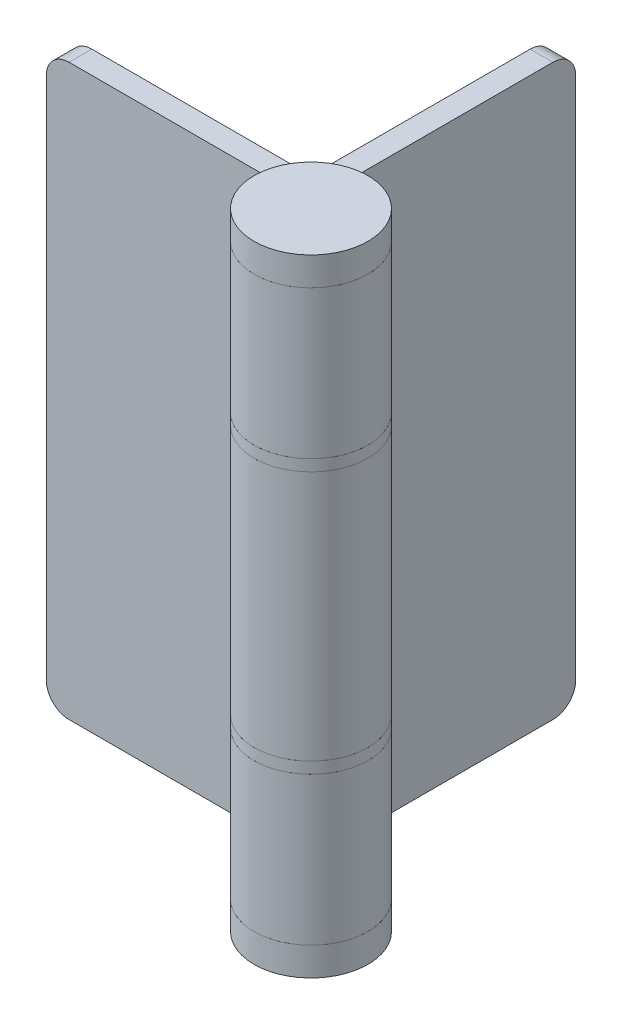
ISO-10303-21;
HEADER;
FILE_DESCRIPTION(('STEP AP214'),'2;1');
FILE_NAME('part.step','',(''),(''),'','','');
FILE_SCHEMA(('AUTOMOTIVE_DESIGN { 1 0 10303 214 1 1 1 1 }'));
ENDSEC;
DATA;
#1=APPLICATION_CONTEXT('core data for automotive mechanical design processes');
#2=APPLICATION_PROTOCOL_DEFINITION('international standard','automotive_design',2000,#1);
#3=PRODUCT_CONTEXT('',#1,'mechanical');
#4=PRODUCT('Part','Part','',(#3));
#5=PRODUCT_RELATED_PRODUCT_CATEGORY('part','',(#4));
#6=PRODUCT_DEFINITION_FORMATION('','',#4);
#7=PRODUCT_DEFINITION_CONTEXT('part definition',#1,'design');
#8=PRODUCT_DEFINITION('design','',#6,#7);
#9=PRODUCT_DEFINITION_SHAPE('','',#8);
#10=(LENGTH_UNIT() NAMED_UNIT(*) SI_UNIT(.MILLI.,.METRE.));
#11=(NAMED_UNIT(*) PLANE_ANGLE_UNIT() SI_UNIT($,.RADIAN.));
#12=(NAMED_UNIT(*) SI_UNIT($,.STERADIAN.) SOLID_ANGLE_UNIT());
#13=UNCERTAINTY_MEASURE_WITH_UNIT(LENGTH_MEASURE(1.E-05),#10,'distance_accuracy_value','');
#14=(GEOMETRIC_REPRESENTATION_CONTEXT(3) GLOBAL_UNCERTAINTY_ASSIGNED_CONTEXT((#13)) GLOBAL_UNIT_ASSIGNED_CONTEXT((#10,
#11,#12)) REPRESENTATION_CONTEXT('',''));
#15=CARTESIAN_POINT('',(0.,0.,0.));
#16=DIRECTION('',(0.,0.,1.));
#17=DIRECTION('',(1.,0.,0.));
#18=AXIS2_PLACEMENT_3D('',#15,#16,#17);
#19=CARTESIAN_POINT('',(-10.4000000000002,46.,-48.5));
#20=DIRECTION('',(1.,0.,0.));
#21=DIRECTION('',(0.,0.,-1.));
#22=AXIS2_PLACEMENT_3D('',#19,#20,#21);
#23=CYLINDRICAL_SURFACE('',#22,4.00000000000002);
#24=CARTESIAN_POINT('',(-10.0000000000002,46.,-48.5));
#25=DIRECTION('',(1.,0.,0.));
#26=DIRECTION('',(0.,0.,-1.));
#27=AXIS2_PLACEMENT_3D('',#24,#25,#26);
#28=CIRCLE('',#27,4.00000000000002);
#29=CARTESIAN_POINT('',(-10.0000000000002,46.,-52.5));
#30=VERTEX_POINT('',#29);
#31=CARTESIAN_POINT('',(-10.0000000000002,50.,-48.5));
#32=VERTEX_POINT('',#31);
#33=EDGE_CURVE('P0_E145',#30,#32,#28,.T.);
#34=ORIENTED_EDGE('',*,*,#33,.T.);
#35=DIRECTION('',(-1.,0.,0.));
#36=VECTOR('',#35,1.);
#37=CARTESIAN_POINT('',(-8.00000000000019,50.,-48.5));
#38=LINE('',#37,#36);
#39=CARTESIAN_POINT('',(-6.00000000000018,50.,-48.5));
#40=VERTEX_POINT('',#39);
#41=EDGE_CURVE('P0_E139',#40,#32,#38,.T.);
#42=ORIENTED_EDGE('',*,*,#41,.F.);
#43=CARTESIAN_POINT('',(-6.00000000000019,46.,-48.5));
#44=DIRECTION('',(1.,0.,0.));
#45=DIRECTION('',(0.,0.,-1.));
#46=AXIS2_PLACEMENT_3D('',#43,#44,#45);
#47=CIRCLE('',#46,4.00000000000002);
#48=CARTESIAN_POINT('',(-6.0000000000002,46.,-52.5));
#49=VERTEX_POINT('',#48);
#50=EDGE_CURVE('P0_E155',#40,#49,#47,.F.);
#51=ORIENTED_EDGE('',*,*,#50,.T.);
#52=DIRECTION('',(-1.,0.,0.));
#53=VECTOR('',#52,1.);
#54=CARTESIAN_POINT('',(-8.0000000000002,46.,-52.5));
#55=LINE('',#54,#53);
#56=EDGE_CURVE('P0_E120',#49,#30,#55,.T.);
#57=ORIENTED_EDGE('',*,*,#56,.T.);
#58=EDGE_LOOP('',(#34,#42,#51,#57));
#59=FACE_BOUND('',#58,.T.);
#60=ADVANCED_FACE('P0_F39',(#59),#23,.T.);
#61=CARTESIAN_POINT('',(-6.00000000000006,50.,-11.));
#62=DIRECTION('',(0.,1.,0.));
#63=DIRECTION('',(0.,0.,-1.));
#64=AXIS2_PLACEMENT_3D('',#61,#62,#63);
#65=PLANE('',#64);
#66=DIRECTION('',(0.,0.,1.));
#67=VECTOR('',#66,1.);
#68=CARTESIAN_POINT('',(-10.0000000000001,50.,-26.25));
#69=LINE('',#68,#67);
#70=CARTESIAN_POINT('',(-10.,50.,-11.));
#71=VERTEX_POINT('',#70);
#72=EDGE_CURVE('P0_E149',#32,#71,#69,.T.);
#73=ORIENTED_EDGE('',*,*,#72,.T.);
#74=DIRECTION('',(1.,0.,0.));
#75=VECTOR('',#74,1.);
#76=CARTESIAN_POINT('',(-8.00000000000005,50.,-11.));
#77=LINE('',#76,#75);
#78=CARTESIAN_POINT('',(-6.00000000000006,50.,-11.));
#79=VERTEX_POINT('',#78);
#80=EDGE_CURVE('P0_E133',#71,#79,#77,.T.);
#81=ORIENTED_EDGE('',*,*,#80,.T.);
#82=DIRECTION('',(0.,0.,-1.));
#83=VECTOR('',#82,1.);
#84=CARTESIAN_POINT('',(-6.00000000000012,50.,-30.25));
#85=LINE('',#84,#83);
#86=EDGE_CURVE('P0_E309',#79,#40,#85,.T.);
#87=ORIENTED_EDGE('',*,*,#86,.T.);
#88=ORIENTED_EDGE('',*,*,#41,.T.);
#89=EDGE_LOOP('',(#73,#81,#87,#88));
#90=FACE_BOUND('',#89,.T.);
#91=ADVANCED_FACE('P0_F252',(#90),#65,.T.);
#92=CARTESIAN_POINT('',(-6.00000000000006,-50.,-11.));
#93=DIRECTION('',(0.,1.,0.));
#94=DIRECTION('',(0.,0.,-1.));
#95=AXIS2_PLACEMENT_3D('',#92,#93,#94);
#96=PLANE('',#95);
#97=DIRECTION('',(-1.,0.,0.));
#98=VECTOR('',#97,1.);
#99=CARTESIAN_POINT('',(-8.00000000000019,-50.,-48.5));
#100=LINE('',#99,#98);
#101=CARTESIAN_POINT('',(-6.00000000000018,-50.,-48.5));
#102=VERTEX_POINT('',#101);
#103=CARTESIAN_POINT('',(-10.0000000000002,-50.,-48.5));
#104=VERTEX_POINT('',#103);
#105=EDGE_CURVE('P0_E156',#102,#104,#100,.T.);
#106=ORIENTED_EDGE('',*,*,#105,.F.);
#107=DIRECTION('',(0.,0.,1.));
#108=VECTOR('',#107,1.);
#109=CARTESIAN_POINT('',(-6.00000000000012,-50.,-30.25));
#110=LINE('',#109,#108);
#111=CARTESIAN_POINT('',(-6.00000000000006,-50.,-11.));
#112=VERTEX_POINT('',#111);
#113=EDGE_CURVE('P0_E316',#102,#112,#110,.T.);
#114=ORIENTED_EDGE('',*,*,#113,.T.);
#115=DIRECTION('',(-1.,0.,0.));
#116=VECTOR('',#115,1.);
#117=CARTESIAN_POINT('',(-8.00000000000005,-50.,-11.));
#118=LINE('',#117,#116);
#119=CARTESIAN_POINT('',(-10.,-50.,-11.));
#120=VERTEX_POINT('',#119);
#121=EDGE_CURVE('P0_E151',#112,#120,#118,.T.);
#122=ORIENTED_EDGE('',*,*,#121,.T.);
#123=DIRECTION('',(0.,0.,-1.));
#124=VECTOR('',#123,1.);
#125=CARTESIAN_POINT('',(-10.0000000000001,-50.,-26.25));
#126=LINE('',#125,#124);
#127=EDGE_CURVE('P0_E162',#120,#104,#126,.T.);
#128=ORIENTED_EDGE('',*,*,#127,.T.);
#129=EDGE_LOOP('',(#106,#114,#122,#128));
#130=FACE_BOUND('',#129,.T.);
#131=ADVANCED_FACE('P0_F245',(#130),#96,.F.);
#132=CARTESIAN_POINT('',(-5.60000000000019,-46.,-48.5));
#133=DIRECTION('',(-1.,0.,0.));
#134=DIRECTION('',(0.,0.,1.));
#135=AXIS2_PLACEMENT_3D('',#132,#133,#134);
#136=CYLINDRICAL_SURFACE('',#135,4.00000000000002);
#137=CARTESIAN_POINT('',(-10.0000000000002,-46.,-48.5));
#138=DIRECTION('',(-1.,0.,0.));
#139=DIRECTION('',(0.,0.,1.));
#140=AXIS2_PLACEMENT_3D('',#137,#138,#139);
#141=CIRCLE('',#140,4.00000000000002);
#142=CARTESIAN_POINT('',(-10.0000000000002,-46.,-52.5));
#143=VERTEX_POINT('',#142);
#144=EDGE_CURVE('P0_E159',#104,#143,#141,.F.);
#145=ORIENTED_EDGE('',*,*,#144,.T.);
#146=DIRECTION('',(1.,0.,0.));
#147=VECTOR('',#146,1.);
#148=CARTESIAN_POINT('',(-8.0000000000002,-46.,-52.5));
#149=LINE('',#148,#147);
#150=CARTESIAN_POINT('',(-6.0000000000002,-46.,-52.5));
#151=VERTEX_POINT('',#150);
#152=EDGE_CURVE('P0_E111',#143,#151,#149,.T.);
#153=ORIENTED_EDGE('',*,*,#152,.T.);
#154=CARTESIAN_POINT('',(-6.00000000000019,-46.,-48.5));
#155=DIRECTION('',(-1.,0.,0.));
#156=DIRECTION('',(0.,0.,1.));
#157=AXIS2_PLACEMENT_3D('',#154,#155,#156);
#158=CIRCLE('',#157,4.00000000000002);
#159=EDGE_CURVE('P0_E314',#151,#102,#158,.T.);
#160=ORIENTED_EDGE('',*,*,#159,.T.);
#161=ORIENTED_EDGE('',*,*,#105,.T.);
#162=EDGE_LOOP('',(#145,#153,#160,#161));
#163=FACE_BOUND('',#162,.T.);
#164=ADVANCED_FACE('P0_F238',(#163),#136,.T.);
#165=CARTESIAN_POINT('',(-10.0000000000002,-46.,-52.5));
#166=DIRECTION('',(0.,0.,1.));
#167=DIRECTION('',(1.,0.,0.));
#168=AXIS2_PLACEMENT_3D('',#165,#166,#167);
#169=PLANE('',#168);
#170=ORIENTED_EDGE('',*,*,#152,.F.);
#171=DIRECTION('',(0.,1.,0.));
#172=VECTOR('',#171,1.);
#173=CARTESIAN_POINT('',(-10.0000000000002,0.,-52.5));
#174=LINE('',#173,#172);
#175=EDGE_CURVE('P0_E148',#143,#30,#174,.T.);
#176=ORIENTED_EDGE('',*,*,#175,.T.);
#177=ORIENTED_EDGE('',*,*,#56,.F.);
#178=DIRECTION('',(0.,-1.,0.));
#179=VECTOR('',#178,1.);
#180=CARTESIAN_POINT('',(-6.0000000000002,0.,-52.5));
#181=LINE('',#180,#179);
#182=EDGE_CURVE('P0_E317',#49,#151,#181,.T.);
#183=ORIENTED_EDGE('',*,*,#182,.T.);
#184=EDGE_LOOP('',(#170,#176,#177,#183));
#185=FACE_BOUND('',#184,.T.);
#186=ADVANCED_FACE('P0_F158',(#185),#169,.F.);
#187=CARTESIAN_POINT('',(-10.,22.,-11.));
#188=DIRECTION('',(0.,0.,-1.));
#189=DIRECTION('',(0.,1.,0.));
#190=AXIS2_PLACEMENT_3D('',#187,#188,#189);
#191=PLANE('',#190);
#192=DIRECTION('',(0.,-1.,0.));
#193=VECTOR('',#192,1.);
#194=CARTESIAN_POINT('',(-10.,0.,-11.));
#195=LINE('',#194,#193);
#196=CARTESIAN_POINT('',(-10.,22.,-11.));
#197=VERTEX_POINT('',#196);
#198=EDGE_CURVE('P0_E167',#71,#197,#195,.T.);
#199=ORIENTED_EDGE('',*,*,#198,.T.);
#200=DIRECTION('',(1.,0.,0.));
#201=VECTOR('',#200,1.);
#202=CARTESIAN_POINT('',(0.0599999999999591,22.,-11.));
#203=LINE('',#202,#201);
#204=CARTESIAN_POINT('',(-6.00000000000005,22.,-11.));
#205=VERTEX_POINT('',#204);
#206=EDGE_CURVE('P0_E176',#197,#205,#203,.T.);
#207=ORIENTED_EDGE('',*,*,#206,.T.);
#208=DIRECTION('',(0.,1.,0.));
#209=VECTOR('',#208,1.);
#210=CARTESIAN_POINT('',(-6.00000000000005,0.,-11.));
#211=LINE('',#210,#209);
#212=EDGE_CURVE('P0_E308',#205,#79,#211,.T.);
#213=ORIENTED_EDGE('',*,*,#212,.T.);
#214=ORIENTED_EDGE('',*,*,#80,.F.);
#215=EDGE_LOOP('',(#199,#207,#213,#214));
#216=FACE_BOUND('',#215,.T.);
#217=ADVANCED_FACE('P0_F224',(#216),#191,.F.);
#218=CARTESIAN_POINT('',(-6.0000000000002,-50.,-52.5));
#219=DIRECTION('',(-1.,0.,0.));
#220=DIRECTION('',(0.,0.,1.));
#221=AXIS2_PLACEMENT_3D('',#218,#219,#220);
#222=PLANE('',#221);
#223=ORIENTED_EDGE('',*,*,#159,.F.);
#224=ORIENTED_EDGE('',*,*,#182,.F.);
#225=ORIENTED_EDGE('',*,*,#50,.F.);
#226=ORIENTED_EDGE('',*,*,#86,.F.);
#227=ORIENTED_EDGE('',*,*,#212,.F.);
#228=DIRECTION('',(0.,0.,1.));
#229=VECTOR('',#228,1.);
#230=CARTESIAN_POINT('',(-6.00000000000002,22.,-0.436999999999974));
#231=LINE('',#230,#229);
#232=CARTESIAN_POINT('',(-6.00000000000004,22.,-7.99999999999998));
#233=VERTEX_POINT('',#232);
#234=EDGE_CURVE('P0_E173',#205,#233,#231,.T.);
#235=ORIENTED_EDGE('',*,*,#234,.T.);
#236=DIRECTION('',(0.,1.,0.));
#237=VECTOR('',#236,1.);
#238=CARTESIAN_POINT('',(-6.00000000000005,0.,-7.99999999999998));
#239=LINE('',#238,#237);
#240=CARTESIAN_POINT('',(-6.00000000000004,-22.,-7.99999999999998));
#241=VERTEX_POINT('',#240);
#242=EDGE_CURVE('P0_E84',#241,#233,#239,.T.);
#243=ORIENTED_EDGE('',*,*,#242,.F.);
#244=DIRECTION('',(0.,0.,-1.));
#245=VECTOR('',#244,1.);
#246=CARTESIAN_POINT('',(-6.00000000000002,-22.,-0.436999999999975));
#247=LINE('',#246,#245);
#248=CARTESIAN_POINT('',(-6.00000000000005,-22.,-11.));
#249=VERTEX_POINT('',#248);
#250=EDGE_CURVE('P0_E178',#241,#249,#247,.T.);
#251=ORIENTED_EDGE('',*,*,#250,.T.);
#252=DIRECTION('',(0.,-1.,0.));
#253=VECTOR('',#252,1.);
#254=CARTESIAN_POINT('',(-6.00000000000006,-36.,-11.));
#255=LINE('',#254,#253);
#256=EDGE_CURVE('P0_E323',#249,#112,#255,.T.);
#257=ORIENTED_EDGE('',*,*,#256,.T.);
#258=ORIENTED_EDGE('',*,*,#113,.F.);
#259=EDGE_LOOP('',(#223,#224,#225,#226,#227,#235,#243,#251,#257,#258));
#260=FACE_BOUND('',#259,.T.);
#261=ADVANCED_FACE('P0_F217',(#260),#222,.F.);
#262=CARTESIAN_POINT('',(-10.,-50.,-11.));
#263=DIRECTION('',(0.,0.,-1.));
#264=DIRECTION('',(0.,1.,0.));
#265=AXIS2_PLACEMENT_3D('',#262,#263,#264);
#266=PLANE('',#265);
#267=DIRECTION('',(0.,-1.,0.));
#268=VECTOR('',#267,1.);
#269=CARTESIAN_POINT('',(-10.,0.,-11.));
#270=LINE('',#269,#268);
#271=CARTESIAN_POINT('',(-10.,-22.,-11.));
#272=VERTEX_POINT('',#271);
#273=EDGE_CURVE('P0_E65',#272,#120,#270,.T.);
#274=ORIENTED_EDGE('',*,*,#273,.T.);
#275=ORIENTED_EDGE('',*,*,#121,.F.);
#276=ORIENTED_EDGE('',*,*,#256,.F.);
#277=DIRECTION('',(-1.,0.,0.));
#278=VECTOR('',#277,1.);
#279=CARTESIAN_POINT('',(0.0599999999999591,-22.,-11.));
#280=LINE('',#279,#278);
#281=EDGE_CURVE('P0_E171',#249,#272,#280,.T.);
#282=ORIENTED_EDGE('',*,*,#281,.T.);
#283=EDGE_LOOP('',(#274,#275,#276,#282));
#284=FACE_BOUND('',#283,.T.);
#285=ADVANCED_FACE('P0_F200',(#284),#266,.F.);
#286=CARTESIAN_POINT('',(-10.,-50.,0.));
#287=DIRECTION('',(1.,0.,0.));
#288=DIRECTION('',(0.,0.,-1.));
#289=AXIS2_PLACEMENT_3D('',#286,#287,#288);
#290=PLANE('',#289);
#291=ORIENTED_EDGE('',*,*,#144,.F.);
#292=ORIENTED_EDGE('',*,*,#127,.F.);
#293=ORIENTED_EDGE('',*,*,#273,.F.);
#294=DIRECTION('',(0.,0.,1.));
#295=VECTOR('',#294,1.);
#296=CARTESIAN_POINT('',(-10.,-22.,-0.436999999999961));
#297=LINE('',#296,#295);
#298=CARTESIAN_POINT('',(-10.,-22.,0.));
#299=VERTEX_POINT('',#298);
#300=EDGE_CURVE('P0_E168',#272,#299,#297,.T.);
#301=ORIENTED_EDGE('',*,*,#300,.T.);
#302=DIRECTION('',(0.,-1.,0.));
#303=VECTOR('',#302,1.);
#304=CARTESIAN_POINT('',(-10.,0.,0.));
#305=LINE('',#304,#303);
#306=CARTESIAN_POINT('',(-10.,22.,0.));
#307=VERTEX_POINT('',#306);
#308=EDGE_CURVE('P0_E56',#307,#299,#305,.T.);
#309=ORIENTED_EDGE('',*,*,#308,.F.);
#310=DIRECTION('',(0.,0.,-1.));
#311=VECTOR('',#310,1.);
#312=CARTESIAN_POINT('',(-10.,22.,-0.43699999999996));
#313=LINE('',#312,#311);
#314=EDGE_CURVE('P0_E174',#307,#197,#313,.T.);
#315=ORIENTED_EDGE('',*,*,#314,.T.);
#316=ORIENTED_EDGE('',*,*,#198,.F.);
#317=ORIENTED_EDGE('',*,*,#72,.F.);
#318=ORIENTED_EDGE('',*,*,#33,.F.);
#319=ORIENTED_EDGE('',*,*,#175,.F.);
#320=EDGE_LOOP('',(#291,#292,#293,#301,#309,#315,#316,#317,#318,#319));
#321=FACE_BOUND('',#320,.T.);
#322=ADVANCED_FACE('P0_F147',(#321),#290,.F.);
#323=CARTESIAN_POINT('',(0.,22.,0.));
#324=DIRECTION('',(0.,-1.,0.));
#325=DIRECTION('',(-1.,0.,0.));
#326=AXIS2_PLACEMENT_3D('',#323,#324,#325);
#327=CYLINDRICAL_SURFACE('',#326,10.);
#328=ORIENTED_EDGE('',*,*,#308,.T.);
#329=CARTESIAN_POINT('',(0.,-22.,0.));
#330=DIRECTION('',(0.,-1.,0.));
#331=DIRECTION('',(-1.,0.,0.));
#332=AXIS2_PLACEMENT_3D('',#329,#330,#331);
#333=CIRCLE('',#332,10.);
#334=EDGE_CURVE('P0_E170',#299,#241,#333,.F.);
#335=ORIENTED_EDGE('',*,*,#334,.T.);
#336=ORIENTED_EDGE('',*,*,#242,.T.);
#337=CARTESIAN_POINT('',(0.,22.,0.));
#338=DIRECTION('',(0.,-1.,0.));
#339=DIRECTION('',(-1.,0.,0.));
#340=AXIS2_PLACEMENT_3D('',#337,#338,#339);
#341=CIRCLE('',#340,10.);
#342=EDGE_CURVE('P0_E43',#233,#307,#341,.T.);
#343=ORIENTED_EDGE('',*,*,#342,.T.);
#344=EDGE_LOOP('',(#328,#335,#336,#343));
#345=FACE_BOUND('',#344,.T.);
#346=ADVANCED_FACE('P0_F41',(#345),#327,.T.);
#347=CARTESIAN_POINT('',(10.12,22.,10.126));
#348=DIRECTION('',(0.,-1.,0.));
#349=DIRECTION('',(-1.,0.,0.));
#350=AXIS2_PLACEMENT_3D('',#347,#348,#349);
#351=PLANE('',#350);
#352=CARTESIAN_POINT('',(0.,22.,0.));
#353=DIRECTION('',(0.,-1.,0.));
#354=DIRECTION('',(-1.,0.,0.));
#355=AXIS2_PLACEMENT_3D('',#352,#353,#354);
#356=CIRCLE('',#355,6.00000000000002);
#357=CARTESIAN_POINT('',(-6.00000000000002,22.,0.));
#358=VERTEX_POINT('',#357);
#359=EDGE_CURVE('P0_E48',#358,#358,#356,.T.);
#360=ORIENTED_EDGE('',*,*,#359,.T.);
#361=EDGE_LOOP('',(#360));
#362=FACE_BOUND('',#361,.T.);
#363=ORIENTED_EDGE('',*,*,#314,.F.);
#364=ORIENTED_EDGE('',*,*,#342,.F.);
#365=ORIENTED_EDGE('',*,*,#234,.F.);
#366=ORIENTED_EDGE('',*,*,#206,.F.);
#367=EDGE_LOOP('',(#363,#364,#365,#366));
#368=FACE_BOUND('',#367,.T.);
#369=ADVANCED_FACE('P0_F183',(#362,#368),#351,.F.);
#370=CARTESIAN_POINT('',(10.12,-22.,10.126));
#371=DIRECTION('',(0.,1.,0.));
#372=DIRECTION('',(0.,0.,-1.));
#373=AXIS2_PLACEMENT_3D('',#370,#371,#372);
#374=PLANE('',#373);
#375=CARTESIAN_POINT('',(0.,-22.,0.));
#376=DIRECTION('',(0.,1.,0.));
#377=DIRECTION('',(1.,0.,0.));
#378=AXIS2_PLACEMENT_3D('',#375,#376,#377);
#379=CIRCLE('',#378,6.00000000000002);
#380=CARTESIAN_POINT('',(6.00000000000002,-22.,0.));
#381=VERTEX_POINT('',#380);
#382=EDGE_CURVE('P0_E12',#381,#381,#379,.T.);
#383=ORIENTED_EDGE('',*,*,#382,.T.);
#384=EDGE_LOOP('',(#383));
#385=FACE_BOUND('',#384,.T.);
#386=ORIENTED_EDGE('',*,*,#300,.F.);
#387=ORIENTED_EDGE('',*,*,#281,.F.);
#388=ORIENTED_EDGE('',*,*,#250,.F.);
#389=ORIENTED_EDGE('',*,*,#334,.F.);
#390=EDGE_LOOP('',(#386,#387,#388,#389));
#391=FACE_BOUND('',#390,.T.);
#392=ADVANCED_FACE('P0_F188',(#385,#391),#374,.F.);
#393=CARTESIAN_POINT('',(0.,22.,0.));
#394=DIRECTION('',(0.,-1.,0.));
#395=DIRECTION('',(-1.,0.,0.));
#396=AXIS2_PLACEMENT_3D('',#393,#394,#395);
#397=CYLINDRICAL_SURFACE('',#396,6.00000000000002);
#398=ORIENTED_EDGE('',*,*,#382,.F.);
#399=EDGE_LOOP('',(#398));
#400=FACE_BOUND('',#399,.T.);
#401=ORIENTED_EDGE('',*,*,#359,.F.);
#402=EDGE_LOOP('',(#401));
#403=FACE_BOUND('',#402,.T.);
#404=ADVANCED_FACE('P0_F186',(#400,#403),#397,.F.);
#405=CLOSED_SHELL('',(#60,#91,#131,#164,#186,#217,#261,#285,#322,#346,#369,#392,#404));
#406=MANIFOLD_SOLID_BREP('P0_B2',#405);
#407=CARTESIAN_POINT('',(10.12,55.,10.12));
#408=DIRECTION('',(0.,-1.,0.));
#409=DIRECTION('',(-1.,0.,0.));
#410=AXIS2_PLACEMENT_3D('',#407,#408,#409);
#411=PLANE('',#410);
#412=CARTESIAN_POINT('',(0.,55.,0.));
#413=DIRECTION('',(0.,1.,0.));
#414=DIRECTION('',(0.,0.,1.));
#415=AXIS2_PLACEMENT_3D('',#412,#413,#414);
#416=CIRCLE('',#415,10.);
#417=CARTESIAN_POINT('',(0.,55.,10.));
#418=VERTEX_POINT('',#417);
#419=EDGE_CURVE('P1_E18',#418,#418,#416,.F.);
#420=ORIENTED_EDGE('',*,*,#419,.F.);
#421=EDGE_LOOP('',(#420));
#422=FACE_BOUND('',#421,.T.);
#423=ADVANCED_FACE('P1_F14',(#422),#411,.F.);
#424=CARTESIAN_POINT('',(0.,49.5,0.));
#425=DIRECTION('',(0.,1.,0.));
#426=DIRECTION('',(0.,0.,1.));
#427=AXIS2_PLACEMENT_3D('',#424,#425,#426);
#428=CYLINDRICAL_SURFACE('',#427,10.);
#429=ORIENTED_EDGE('',*,*,#419,.T.);
#430=EDGE_LOOP('',(#429));
#431=FACE_BOUND('',#430,.T.);
#432=CARTESIAN_POINT('',(0.,50.,0.));
#433=DIRECTION('',(0.,1.,0.));
#434=DIRECTION('',(0.,0.,1.));
#435=AXIS2_PLACEMENT_3D('',#432,#433,#434);
#436=CIRCLE('',#435,10.);
#437=CARTESIAN_POINT('',(0.,50.,10.));
#438=VERTEX_POINT('',#437);
#439=EDGE_CURVE('P1_E39',#438,#438,#436,.T.);
#440=ORIENTED_EDGE('',*,*,#439,.T.);
#441=EDGE_LOOP('',(#440));
#442=FACE_BOUND('',#441,.T.);
#443=ADVANCED_FACE('P1_F48',(#431,#442),#428,.T.);
#444=CARTESIAN_POINT('',(-10.12,50.,10.12));
#445=DIRECTION('',(0.,1.,0.));
#446=DIRECTION('',(1.,0.,0.));
#447=AXIS2_PLACEMENT_3D('',#444,#445,#446);
#448=PLANE('',#447);
#449=CARTESIAN_POINT('',(0.,50.,0.));
#450=DIRECTION('',(0.,1.,0.));
#451=DIRECTION('',(0.,0.,1.));
#452=AXIS2_PLACEMENT_3D('',#449,#450,#451);
#453=CIRCLE('',#452,6.);
#454=CARTESIAN_POINT('',(0.,50.,6.00000000000006));
#455=VERTEX_POINT('',#454);
#456=EDGE_CURVE('P1_E36',#455,#455,#453,.F.);
#457=ORIENTED_EDGE('',*,*,#456,.F.);
#458=EDGE_LOOP('',(#457));
#459=FACE_BOUND('',#458,.T.);
#460=ORIENTED_EDGE('',*,*,#439,.F.);
#461=EDGE_LOOP('',(#460));
#462=FACE_BOUND('',#461,.T.);
#463=ADVANCED_FACE('P1_F56',(#459,#462),#448,.F.);
#464=CARTESIAN_POINT('',(0.,-50.,0.));
#465=DIRECTION('',(0.,1.,0.));
#466=DIRECTION('',(0.,0.,1.));
#467=AXIS2_PLACEMENT_3D('',#464,#465,#466);
#468=CYLINDRICAL_SURFACE('',#467,6.);
#469=ORIENTED_EDGE('',*,*,#456,.T.);
#470=EDGE_LOOP('',(#469));
#471=FACE_BOUND('',#470,.T.);
#472=CARTESIAN_POINT('',(0.,-50.,0.));
#473=DIRECTION('',(0.,1.,0.));
#474=DIRECTION('',(0.,0.,1.));
#475=AXIS2_PLACEMENT_3D('',#472,#473,#474);
#476=CIRCLE('',#475,6.);
#477=CARTESIAN_POINT('',(0.,-50.,6.));
#478=VERTEX_POINT('',#477);
#479=EDGE_CURVE('P1_E30',#478,#478,#476,.T.);
#480=ORIENTED_EDGE('',*,*,#479,.T.);
#481=EDGE_LOOP('',(#480));
#482=FACE_BOUND('',#481,.T.);
#483=ADVANCED_FACE('P1_F69',(#471,#482),#468,.T.);
#484=CARTESIAN_POINT('',(-10.12,-55.,10.12));
#485=DIRECTION('',(0.,1.,0.));
#486=DIRECTION('',(1.,0.,0.));
#487=AXIS2_PLACEMENT_3D('',#484,#485,#486);
#488=PLANE('',#487);
#489=CARTESIAN_POINT('',(0.,-55.,0.));
#490=DIRECTION('',(0.,1.,0.));
#491=DIRECTION('',(0.,0.,1.));
#492=AXIS2_PLACEMENT_3D('',#489,#490,#491);
#493=CIRCLE('',#492,10.);
#494=CARTESIAN_POINT('',(0.,-55.,10.));
#495=VERTEX_POINT('',#494);
#496=EDGE_CURVE('P1_E23',#495,#495,#493,.T.);
#497=ORIENTED_EDGE('',*,*,#496,.F.);
#498=EDGE_LOOP('',(#497));
#499=FACE_BOUND('',#498,.T.);
#500=ADVANCED_FACE('P1_F63',(#499),#488,.F.);
#501=CARTESIAN_POINT('',(10.12,-50.,10.12));
#502=DIRECTION('',(0.,-1.,0.));
#503=DIRECTION('',(-1.,0.,0.));
#504=AXIS2_PLACEMENT_3D('',#501,#502,#503);
#505=PLANE('',#504);
#506=ORIENTED_EDGE('',*,*,#479,.F.);
#507=EDGE_LOOP('',(#506));
#508=FACE_BOUND('',#507,.T.);
#509=CARTESIAN_POINT('',(0.,-50.,0.));
#510=DIRECTION('',(0.,1.,0.));
#511=DIRECTION('',(0.,0.,1.));
#512=AXIS2_PLACEMENT_3D('',#509,#510,#511);
#513=CIRCLE('',#512,10.);
#514=CARTESIAN_POINT('',(0.,-50.,10.));
#515=VERTEX_POINT('',#514);
#516=EDGE_CURVE('P1_E10',#515,#515,#513,.F.);
#517=ORIENTED_EDGE('',*,*,#516,.F.);
#518=EDGE_LOOP('',(#517));
#519=FACE_BOUND('',#518,.T.);
#520=ADVANCED_FACE('P1_F59',(#508,#519),#505,.F.);
#521=CARTESIAN_POINT('',(0.,-55.5,0.));
#522=DIRECTION('',(0.,1.,0.));
#523=DIRECTION('',(0.,0.,1.));
#524=AXIS2_PLACEMENT_3D('',#521,#522,#523);
#525=CYLINDRICAL_SURFACE('',#524,10.);
#526=ORIENTED_EDGE('',*,*,#516,.T.);
#527=EDGE_LOOP('',(#526));
#528=FACE_BOUND('',#527,.T.);
#529=ORIENTED_EDGE('',*,*,#496,.T.);
#530=EDGE_LOOP('',(#529));
#531=FACE_BOUND('',#530,.T.);
#532=ADVANCED_FACE('P1_F16',(#528,#531),#525,.T.);
#533=CLOSED_SHELL('',(#423,#443,#463,#483,#500,#520,#532));
#534=MANIFOLD_SOLID_BREP('P1_B1',#533);
#535=CARTESIAN_POINT('',(0.,50.,0.));
#536=DIRECTION('',(0.,-1.,0.));
#537=DIRECTION('',(1.,0.,0.));
#538=AXIS2_PLACEMENT_3D('',#535,#536,#537);
#539=CYLINDRICAL_SURFACE('',#538,6.);
#540=CARTESIAN_POINT('',(0.,24.,0.));
#541=DIRECTION('',(0.,-1.,0.));
#542=DIRECTION('',(1.,0.,0.));
#543=AXIS2_PLACEMENT_3D('',#540,#541,#542);
#544=CIRCLE('',#543,6.);
#545=CARTESIAN_POINT('',(6.00000000000002,24.,0.));
#546=VERTEX_POINT('',#545);
#547=EDGE_CURVE('P2_E149',#546,#546,#544,.T.);
#548=ORIENTED_EDGE('',*,*,#547,.T.);
#549=EDGE_LOOP('',(#548));
#550=FACE_BOUND('',#549,.T.);
#551=CARTESIAN_POINT('',(0.,50.,0.));
#552=DIRECTION('',(0.,1.,0.));
#553=DIRECTION('',(0.,0.,1.));
#554=AXIS2_PLACEMENT_3D('',#551,#552,#553);
#555=CIRCLE('',#554,6.);
#556=CARTESIAN_POINT('',(0.,50.,6.));
#557=VERTEX_POINT('',#556);
#558=EDGE_CURVE('P2_E20',#557,#557,#555,.F.);
#559=ORIENTED_EDGE('',*,*,#558,.F.);
#560=EDGE_LOOP('',(#559));
#561=FACE_BOUND('',#560,.T.);
#562=ADVANCED_FACE('P2_F16',(#550,#561),#539,.F.);
#563=CARTESIAN_POINT('',(-48.5,46.,-5.6));
#564=DIRECTION('',(0.,0.,-1.));
#565=DIRECTION('',(-1.,0.,0.));
#566=AXIS2_PLACEMENT_3D('',#563,#564,#565);
#567=CYLINDRICAL_SURFACE('',#566,4.);
#568=CARTESIAN_POINT('',(-48.5,46.,-6.));
#569=DIRECTION('',(0.,0.,-1.));
#570=DIRECTION('',(-1.,0.,0.));
#571=AXIS2_PLACEMENT_3D('',#568,#569,#570);
#572=CIRCLE('',#571,4.);
#573=CARTESIAN_POINT('',(-52.5,46.,-6.));
#574=VERTEX_POINT('',#573);
#575=CARTESIAN_POINT('',(-48.5,50.,-6.));
#576=VERTEX_POINT('',#575);
#577=EDGE_CURVE('P2_E138',#574,#576,#572,.T.);
#578=ORIENTED_EDGE('',*,*,#577,.T.);
#579=DIRECTION('',(0.,0.,1.));
#580=VECTOR('',#579,1.);
#581=CARTESIAN_POINT('',(-48.5,50.,0.060000000000001));
#582=LINE('',#581,#580);
#583=CARTESIAN_POINT('',(-48.5,50.,-10.));
#584=VERTEX_POINT('',#583);
#585=EDGE_CURVE('P2_E112',#584,#576,#582,.T.);
#586=ORIENTED_EDGE('',*,*,#585,.F.);
#587=CARTESIAN_POINT('',(-48.5,46.,-10.));
#588=DIRECTION('',(0.,0.,-1.));
#589=DIRECTION('',(-1.,0.,0.));
#590=AXIS2_PLACEMENT_3D('',#587,#588,#589);
#591=CIRCLE('',#590,4.);
#592=CARTESIAN_POINT('',(-52.5,46.,-9.99999999999999));
#593=VERTEX_POINT('',#592);
#594=EDGE_CURVE('P2_E99',#584,#593,#591,.F.);
#595=ORIENTED_EDGE('',*,*,#594,.T.);
#596=DIRECTION('',(0.,0.,1.));
#597=VECTOR('',#596,1.);
#598=CARTESIAN_POINT('',(-52.5,46.,-8.));
#599=LINE('',#598,#597);
#600=EDGE_CURVE('P2_E153',#593,#574,#599,.T.);
#601=ORIENTED_EDGE('',*,*,#600,.T.);
#602=EDGE_LOOP('',(#578,#586,#595,#601));
#603=FACE_BOUND('',#602,.T.);
#604=ADVANCED_FACE('P2_F263',(#603),#567,.T.);
#605=CARTESIAN_POINT('',(-48.5,50.,10.12));
#606=DIRECTION('',(0.,1.,0.));
#607=DIRECTION('',(1.,0.,0.));
#608=AXIS2_PLACEMENT_3D('',#605,#606,#607);
#609=PLANE('',#608);
#610=ORIENTED_EDGE('',*,*,#558,.T.);
#611=EDGE_LOOP('',(#610));
#612=FACE_BOUND('',#611,.T.);
#613=DIRECTION('',(1.,0.,0.));
#614=VECTOR('',#613,1.);
#615=CARTESIAN_POINT('',(-30.25,50.,-6.));
#616=LINE('',#615,#614);
#617=CARTESIAN_POINT('',(-8.,50.,-6.));
#618=VERTEX_POINT('',#617);
#619=EDGE_CURVE('P2_E82',#576,#618,#616,.T.);
#620=ORIENTED_EDGE('',*,*,#619,.T.);
#621=CARTESIAN_POINT('',(0.,50.,0.));
#622=DIRECTION('',(0.,-1.,0.));
#623=DIRECTION('',(1.,0.,0.));
#624=AXIS2_PLACEMENT_3D('',#621,#622,#623);
#625=CIRCLE('',#624,10.);
#626=CARTESIAN_POINT('',(0.,50.,-10.));
#627=VERTEX_POINT('',#626);
#628=EDGE_CURVE('P2_E77',#627,#618,#625,.T.);
#629=ORIENTED_EDGE('',*,*,#628,.F.);
#630=DIRECTION('',(-1.,0.,0.));
#631=VECTOR('',#630,1.);
#632=CARTESIAN_POINT('',(-26.25,50.,-10.));
#633=LINE('',#632,#631);
#634=EDGE_CURVE('P2_E80',#627,#584,#633,.T.);
#635=ORIENTED_EDGE('',*,*,#634,.T.);
#636=ORIENTED_EDGE('',*,*,#585,.T.);
#637=EDGE_LOOP('',(#620,#629,#635,#636));
#638=FACE_BOUND('',#637,.T.);
#639=ADVANCED_FACE('P2_F79',(#612,#638),#609,.T.);
#640=CARTESIAN_POINT('',(0.,50.,0.));
#641=DIRECTION('',(0.,-1.,0.));
#642=DIRECTION('',(1.,0.,0.));
#643=AXIS2_PLACEMENT_3D('',#640,#641,#642);
#644=CYLINDRICAL_SURFACE('',#643,10.);
#645=DIRECTION('',(0.,1.,0.));
#646=VECTOR('',#645,1.);
#647=CARTESIAN_POINT('',(0.,0.,-10.));
#648=LINE('',#647,#646);
#649=CARTESIAN_POINT('',(0.,24.,-10.));
#650=VERTEX_POINT('',#649);
#651=EDGE_CURVE('P2_E95',#650,#627,#648,.T.);
#652=ORIENTED_EDGE('',*,*,#651,.T.);
#653=ORIENTED_EDGE('',*,*,#628,.T.);
#654=DIRECTION('',(0.,-1.,0.));
#655=VECTOR('',#654,1.);
#656=CARTESIAN_POINT('',(-8.,0.,-6.));
#657=LINE('',#656,#655);
#658=CARTESIAN_POINT('',(-8.,24.,-6.));
#659=VERTEX_POINT('',#658);
#660=EDGE_CURVE('P2_E175',#618,#659,#657,.T.);
#661=ORIENTED_EDGE('',*,*,#660,.T.);
#662=CARTESIAN_POINT('',(0.,24.,0.));
#663=DIRECTION('',(0.,-1.,0.));
#664=DIRECTION('',(1.,0.,0.));
#665=AXIS2_PLACEMENT_3D('',#662,#663,#664);
#666=CIRCLE('',#665,10.);
#667=EDGE_CURVE('P2_E88',#659,#650,#666,.F.);
#668=ORIENTED_EDGE('',*,*,#667,.T.);
#669=EDGE_LOOP('',(#652,#653,#661,#668));
#670=FACE_BOUND('',#669,.T.);
#671=ADVANCED_FACE('P2_F102',(#670),#644,.T.);
#672=CARTESIAN_POINT('',(-11.,24.,10.12));
#673=DIRECTION('',(0.,1.,0.));
#674=DIRECTION('',(1.,0.,0.));
#675=AXIS2_PLACEMENT_3D('',#672,#673,#674);
#676=PLANE('',#675);
#677=ORIENTED_EDGE('',*,*,#547,.F.);
#678=EDGE_LOOP('',(#677));
#679=FACE_BOUND('',#678,.T.);
#680=DIRECTION('',(-1.,0.,0.));
#681=VECTOR('',#680,1.);
#682=CARTESIAN_POINT('',(-30.25,24.,-6.));
#683=LINE('',#682,#681);
#684=CARTESIAN_POINT('',(-11.,24.,-6.));
#685=VERTEX_POINT('',#684);
#686=EDGE_CURVE('P2_E169',#659,#685,#683,.T.);
#687=ORIENTED_EDGE('',*,*,#686,.T.);
#688=DIRECTION('',(0.,0.,-1.));
#689=VECTOR('',#688,1.);
#690=CARTESIAN_POINT('',(-11.,24.,-8.00000000000001));
#691=LINE('',#690,#689);
#692=CARTESIAN_POINT('',(-11.,24.,-10.));
#693=VERTEX_POINT('',#692);
#694=EDGE_CURVE('P2_E159',#685,#693,#691,.T.);
#695=ORIENTED_EDGE('',*,*,#694,.T.);
#696=DIRECTION('',(1.,0.,0.));
#697=VECTOR('',#696,1.);
#698=CARTESIAN_POINT('',(-26.25,24.,-10.));
#699=LINE('',#698,#697);
#700=EDGE_CURVE('P2_E104',#693,#650,#699,.T.);
#701=ORIENTED_EDGE('',*,*,#700,.T.);
#702=ORIENTED_EDGE('',*,*,#667,.F.);
#703=EDGE_LOOP('',(#687,#695,#701,#702));
#704=FACE_BOUND('',#703,.T.);
#705=ADVANCED_FACE('P2_F267',(#679,#704),#676,.F.);
#706=CARTESIAN_POINT('',(-52.5,-46.,-6.));
#707=DIRECTION('',(1.,0.,0.));
#708=DIRECTION('',(0.,0.,-1.));
#709=AXIS2_PLACEMENT_3D('',#706,#707,#708);
#710=PLANE('',#709);
#711=DIRECTION('',(0.,0.,-1.));
#712=VECTOR('',#711,1.);
#713=CARTESIAN_POINT('',(-52.5,-46.,-7.99999999999999));
#714=LINE('',#713,#712);
#715=CARTESIAN_POINT('',(-52.5,-46.,-5.99999999999999));
#716=VERTEX_POINT('',#715);
#717=CARTESIAN_POINT('',(-52.5,-46.,-9.99999999999999));
#718=VERTEX_POINT('',#717);
#719=EDGE_CURVE('P2_E142',#716,#718,#714,.T.);
#720=ORIENTED_EDGE('',*,*,#719,.F.);
#721=DIRECTION('',(0.,1.,0.));
#722=VECTOR('',#721,1.);
#723=CARTESIAN_POINT('',(-52.5,0.,-6.));
#724=LINE('',#723,#722);
#725=EDGE_CURVE('P2_E136',#716,#574,#724,.T.);
#726=ORIENTED_EDGE('',*,*,#725,.T.);
#727=ORIENTED_EDGE('',*,*,#600,.F.);
#728=DIRECTION('',(0.,-1.,0.));
#729=VECTOR('',#728,1.);
#730=CARTESIAN_POINT('',(-52.5,0.,-10.));
#731=LINE('',#730,#729);
#732=EDGE_CURVE('P2_E146',#593,#718,#731,.T.);
#733=ORIENTED_EDGE('',*,*,#732,.T.);
#734=EDGE_LOOP('',(#720,#726,#727,#733));
#735=FACE_BOUND('',#734,.T.);
#736=ADVANCED_FACE('P2_F265',(#735),#710,.F.);
#737=CARTESIAN_POINT('',(-11.,-24.,-6.00000000000001));
#738=DIRECTION('',(-1.,0.,0.));
#739=DIRECTION('',(0.,1.,0.));
#740=AXIS2_PLACEMENT_3D('',#737,#738,#739);
#741=PLANE('',#740);
#742=DIRECTION('',(0.,-1.,0.));
#743=VECTOR('',#742,1.);
#744=CARTESIAN_POINT('',(-11.,0.,-6.));
#745=LINE('',#744,#743);
#746=CARTESIAN_POINT('',(-11.,-24.,-6.));
#747=VERTEX_POINT('',#746);
#748=EDGE_CURVE('P2_E166',#685,#747,#745,.T.);
#749=ORIENTED_EDGE('',*,*,#748,.T.);
#750=DIRECTION('',(0.,0.,-1.));
#751=VECTOR('',#750,1.);
#752=CARTESIAN_POINT('',(-11.,-24.,0.0599999999999976));
#753=LINE('',#752,#751);
#754=CARTESIAN_POINT('',(-11.,-24.,-10.));
#755=VERTEX_POINT('',#754);
#756=EDGE_CURVE('P2_E127',#747,#755,#753,.T.);
#757=ORIENTED_EDGE('',*,*,#756,.T.);
#758=DIRECTION('',(0.,1.,0.));
#759=VECTOR('',#758,1.);
#760=CARTESIAN_POINT('',(-11.,0.,-10.));
#761=LINE('',#760,#759);
#762=EDGE_CURVE('P2_E109',#755,#693,#761,.T.);
#763=ORIENTED_EDGE('',*,*,#762,.T.);
#764=ORIENTED_EDGE('',*,*,#694,.F.);
#765=EDGE_LOOP('',(#749,#757,#763,#764));
#766=FACE_BOUND('',#765,.T.);
#767=ADVANCED_FACE('P2_F257',(#766),#741,.F.);
#768=CARTESIAN_POINT('',(0.,-24.,0.));
#769=DIRECTION('',(0.,-1.,0.));
#770=DIRECTION('',(0.,0.,-1.));
#771=AXIS2_PLACEMENT_3D('',#768,#769,#770);
#772=CYLINDRICAL_SURFACE('',#771,10.);
#773=CARTESIAN_POINT('',(0.,-50.,0.));
#774=DIRECTION('',(0.,-1.,0.));
#775=DIRECTION('',(0.,0.,-1.));
#776=AXIS2_PLACEMENT_3D('',#773,#774,#775);
#777=CIRCLE('',#776,10.);
#778=CARTESIAN_POINT('',(-8.,-50.,-6.));
#779=VERTEX_POINT('',#778);
#780=CARTESIAN_POINT('',(0.,-50.,-10.));
#781=VERTEX_POINT('',#780);
#782=EDGE_CURVE('P2_E123',#779,#781,#777,.F.);
#783=ORIENTED_EDGE('',*,*,#782,.T.);
#784=DIRECTION('',(0.,1.,0.));
#785=VECTOR('',#784,1.);
#786=CARTESIAN_POINT('',(0.,0.,-10.));
#787=LINE('',#786,#785);
#788=CARTESIAN_POINT('',(0.,-24.,-10.));
#789=VERTEX_POINT('',#788);
#790=EDGE_CURVE('P2_E162',#781,#789,#787,.T.);
#791=ORIENTED_EDGE('',*,*,#790,.T.);
#792=CARTESIAN_POINT('',(0.,-24.,0.));
#793=DIRECTION('',(0.,-1.,0.));
#794=DIRECTION('',(0.,0.,-1.));
#795=AXIS2_PLACEMENT_3D('',#792,#793,#794);
#796=CIRCLE('',#795,10.);
#797=CARTESIAN_POINT('',(-8.,-24.,-6.));
#798=VERTEX_POINT('',#797);
#799=EDGE_CURVE('P2_E128',#789,#798,#796,.T.);
#800=ORIENTED_EDGE('',*,*,#799,.T.);
#801=DIRECTION('',(0.,-1.,0.));
#802=VECTOR('',#801,1.);
#803=CARTESIAN_POINT('',(-8.,0.,-6.));
#804=LINE('',#803,#802);
#805=EDGE_CURVE('P2_E137',#798,#779,#804,.T.);
#806=ORIENTED_EDGE('',*,*,#805,.T.);
#807=EDGE_LOOP('',(#783,#791,#800,#806));
#808=FACE_BOUND('',#807,.T.);
#809=ADVANCED_FACE('P2_F246',(#808),#772,.T.);
#810=CARTESIAN_POINT('',(-52.5,-50.,-10.));
#811=DIRECTION('',(0.,0.,1.));
#812=DIRECTION('',(1.,0.,0.));
#813=AXIS2_PLACEMENT_3D('',#810,#811,#812);
#814=PLANE('',#813);
#815=CARTESIAN_POINT('',(-48.5,-46.,-10.));
#816=DIRECTION('',(0.,0.,1.));
#817=DIRECTION('',(1.,0.,0.));
#818=AXIS2_PLACEMENT_3D('',#815,#816,#817);
#819=CIRCLE('',#818,4.00000000000002);
#820=CARTESIAN_POINT('',(-48.5,-50.,-10.));
#821=VERTEX_POINT('',#820);
#822=EDGE_CURVE('P2_E143',#718,#821,#819,.T.);
#823=ORIENTED_EDGE('',*,*,#822,.F.);
#824=ORIENTED_EDGE('',*,*,#732,.F.);
#825=ORIENTED_EDGE('',*,*,#594,.F.);
#826=ORIENTED_EDGE('',*,*,#634,.F.);
#827=ORIENTED_EDGE('',*,*,#651,.F.);
#828=ORIENTED_EDGE('',*,*,#700,.F.);
#829=ORIENTED_EDGE('',*,*,#762,.F.);
#830=DIRECTION('',(1.,0.,0.));
#831=VECTOR('',#830,1.);
#832=CARTESIAN_POINT('',(-0.436999999999996,-24.,-10.));
#833=LINE('',#832,#831);
#834=EDGE_CURVE('P2_E133',#755,#789,#833,.T.);
#835=ORIENTED_EDGE('',*,*,#834,.T.);
#836=ORIENTED_EDGE('',*,*,#790,.F.);
#837=DIRECTION('',(-1.,0.,0.));
#838=VECTOR('',#837,1.);
#839=CARTESIAN_POINT('',(-19.0745,-50.,-10.));
#840=LINE('',#839,#838);
#841=EDGE_CURVE('P2_E126',#781,#821,#840,.T.);
#842=ORIENTED_EDGE('',*,*,#841,.T.);
#843=EDGE_LOOP('',(#823,#824,#825,#826,#827,#828,#829,#835,#836,#842));
#844=FACE_BOUND('',#843,.T.);
#845=ADVANCED_FACE('P2_F93',(#844),#814,.F.);
#846=CARTESIAN_POINT('',(-48.5,-46.,-10.4));
#847=DIRECTION('',(0.,0.,1.));
#848=DIRECTION('',(1.,0.,0.));
#849=AXIS2_PLACEMENT_3D('',#846,#847,#848);
#850=CYLINDRICAL_SURFACE('',#849,4.00000000000002);
#851=CARTESIAN_POINT('',(-48.5,-46.,-6.));
#852=DIRECTION('',(0.,0.,1.));
#853=DIRECTION('',(1.,0.,0.));
#854=AXIS2_PLACEMENT_3D('',#851,#852,#853);
#855=CIRCLE('',#854,4.00000000000002);
#856=CARTESIAN_POINT('',(-48.5,-50.,-6.));
#857=VERTEX_POINT('',#856);
#858=EDGE_CURVE('P2_E36',#857,#716,#855,.F.);
#859=ORIENTED_EDGE('',*,*,#858,.T.);
#860=ORIENTED_EDGE('',*,*,#719,.T.);
#861=ORIENTED_EDGE('',*,*,#822,.T.);
#862=DIRECTION('',(0.,0.,1.));
#863=VECTOR('',#862,1.);
#864=CARTESIAN_POINT('',(-48.5,-50.,0.060000000000001));
#865=LINE('',#864,#863);
#866=EDGE_CURVE('P2_E172',#821,#857,#865,.T.);
#867=ORIENTED_EDGE('',*,*,#866,.T.);
#868=EDGE_LOOP('',(#859,#860,#861,#867));
#869=FACE_BOUND('',#868,.T.);
#870=ADVANCED_FACE('P2_F242',(#869),#850,.T.);
#871=CARTESIAN_POINT('',(-8.,-50.,-6.));
#872=DIRECTION('',(0.,0.,-1.));
#873=DIRECTION('',(-1.,0.,0.));
#874=AXIS2_PLACEMENT_3D('',#871,#872,#873);
#875=PLANE('',#874);
#876=ORIENTED_EDGE('',*,*,#858,.F.);
#877=DIRECTION('',(1.,0.,0.));
#878=VECTOR('',#877,1.);
#879=CARTESIAN_POINT('',(-19.0745,-50.,-6.));
#880=LINE('',#879,#878);
#881=EDGE_CURVE('P2_E122',#857,#779,#880,.T.);
#882=ORIENTED_EDGE('',*,*,#881,.T.);
#883=ORIENTED_EDGE('',*,*,#805,.F.);
#884=DIRECTION('',(-1.,0.,0.));
#885=VECTOR('',#884,1.);
#886=CARTESIAN_POINT('',(-0.436999999999996,-24.,-6.));
#887=LINE('',#886,#885);
#888=EDGE_CURVE('P2_E132',#798,#747,#887,.T.);
#889=ORIENTED_EDGE('',*,*,#888,.T.);
#890=ORIENTED_EDGE('',*,*,#748,.F.);
#891=ORIENTED_EDGE('',*,*,#686,.F.);
#892=ORIENTED_EDGE('',*,*,#660,.F.);
#893=ORIENTED_EDGE('',*,*,#619,.F.);
#894=ORIENTED_EDGE('',*,*,#577,.F.);
#895=ORIENTED_EDGE('',*,*,#725,.F.);
#896=EDGE_LOOP('',(#876,#882,#883,#889,#890,#891,#892,#893,#894,#895));
#897=FACE_BOUND('',#896,.T.);
#898=ADVANCED_FACE('P2_F232',(#897),#875,.F.);
#899=CARTESIAN_POINT('',(-11.,-24.,10.12));
#900=DIRECTION('',(0.,-1.,0.));
#901=DIRECTION('',(0.,0.,-1.));
#902=AXIS2_PLACEMENT_3D('',#899,#900,#901);
#903=PLANE('',#902);
#904=CARTESIAN_POINT('',(0.,-24.,0.));
#905=DIRECTION('',(0.,-1.,0.));
#906=DIRECTION('',(0.,0.,-1.));
#907=AXIS2_PLACEMENT_3D('',#904,#905,#906);
#908=CIRCLE('',#907,6.);
#909=CARTESIAN_POINT('',(0.,-24.,-6.));
#910=VERTEX_POINT('',#909);
#911=EDGE_CURVE('P2_E27',#910,#910,#908,.T.);
#912=ORIENTED_EDGE('',*,*,#911,.T.);
#913=EDGE_LOOP('',(#912));
#914=FACE_BOUND('',#913,.T.);
#915=ORIENTED_EDGE('',*,*,#888,.F.);
#916=ORIENTED_EDGE('',*,*,#799,.F.);
#917=ORIENTED_EDGE('',*,*,#834,.F.);
#918=ORIENTED_EDGE('',*,*,#756,.F.);
#919=EDGE_LOOP('',(#915,#916,#917,#918));
#920=FACE_BOUND('',#919,.T.);
#921=ADVANCED_FACE('P2_F251',(#914,#920),#903,.F.);
#922=CARTESIAN_POINT('',(-48.5,-50.,10.12));
#923=DIRECTION('',(0.,1.,0.));
#924=DIRECTION('',(1.,0.,0.));
#925=AXIS2_PLACEMENT_3D('',#922,#923,#924);
#926=PLANE('',#925);
#927=CARTESIAN_POINT('',(0.,-50.,0.));
#928=DIRECTION('',(0.,1.,0.));
#929=DIRECTION('',(0.,0.,1.));
#930=AXIS2_PLACEMENT_3D('',#927,#928,#929);
#931=CIRCLE('',#930,6.);
#932=CARTESIAN_POINT('',(0.,-50.,6.));
#933=VERTEX_POINT('',#932);
#934=EDGE_CURVE('P2_E11',#933,#933,#931,.T.);
#935=ORIENTED_EDGE('',*,*,#934,.T.);
#936=EDGE_LOOP('',(#935));
#937=FACE_BOUND('',#936,.T.);
#938=ORIENTED_EDGE('',*,*,#866,.F.);
#939=ORIENTED_EDGE('',*,*,#841,.F.);
#940=ORIENTED_EDGE('',*,*,#782,.F.);
#941=ORIENTED_EDGE('',*,*,#881,.F.);
#942=EDGE_LOOP('',(#938,#939,#940,#941));
#943=FACE_BOUND('',#942,.T.);
#944=ADVANCED_FACE('P2_F239',(#937,#943),#926,.F.);
#945=CARTESIAN_POINT('',(0.,-24.,0.));
#946=DIRECTION('',(0.,-1.,0.));
#947=DIRECTION('',(0.,0.,-1.));
#948=AXIS2_PLACEMENT_3D('',#945,#946,#947);
#949=CYLINDRICAL_SURFACE('',#948,6.);
#950=ORIENTED_EDGE('',*,*,#934,.F.);
#951=EDGE_LOOP('',(#950));
#952=FACE_BOUND('',#951,.T.);
#953=ORIENTED_EDGE('',*,*,#911,.F.);
#954=EDGE_LOOP('',(#953));
#955=FACE_BOUND('',#954,.T.);
#956=ADVANCED_FACE('P2_F18',(#952,#955),#949,.F.);
#957=CLOSED_SHELL('',(#562,#604,#639,#671,#705,#736,#767,#809,#845,#870,#898,#921,#944,#956));
#958=MANIFOLD_SOLID_BREP('P2_B1',#957);
#959=CARTESIAN_POINT('',(0.,-21.8,0.));
#960=DIRECTION('',(0.,-1.,0.));
#961=DIRECTION('',(0.,0.,-1.));
#962=AXIS2_PLACEMENT_3D('',#959,#960,#961);
#963=CYLINDRICAL_SURFACE('',#962,10.);
#964=CARTESIAN_POINT('',(0.,-24.,0.));
#965=DIRECTION('',(0.,-1.,0.));
#966=DIRECTION('',(0.,0.,-1.));
#967=AXIS2_PLACEMENT_3D('',#964,#965,#966);
#968=CIRCLE('',#967,10.);
#969=CARTESIAN_POINT('',(0.,-24.,-10.));
#970=VERTEX_POINT('',#969);
#971=EDGE_CURVE('P3_E32',#970,#970,#968,.F.);
#972=ORIENTED_EDGE('',*,*,#971,.T.);
#973=EDGE_LOOP('',(#972));
#974=FACE_BOUND('',#973,.T.);
#975=CARTESIAN_POINT('',(0.,-22.,0.));
#976=DIRECTION('',(0.,1.,0.));
#977=DIRECTION('',(0.,0.,1.));
#978=AXIS2_PLACEMENT_3D('',#975,#976,#977);
#979=CIRCLE('',#978,10.);
#980=CARTESIAN_POINT('',(0.,-22.,10.));
#981=VERTEX_POINT('',#980);
#982=EDGE_CURVE('P3_E18',#981,#981,#979,.T.);
#983=ORIENTED_EDGE('',*,*,#982,.F.);
#984=EDGE_LOOP('',(#983));
#985=FACE_BOUND('',#984,.T.);
#986=ADVANCED_FACE('P3_F14',(#974,#985),#963,.T.);
#987=CARTESIAN_POINT('',(-10.12,-22.,10.12));
#988=DIRECTION('',(0.,1.,0.));
#989=DIRECTION('',(1.,0.,0.));
#990=AXIS2_PLACEMENT_3D('',#987,#988,#989);
#991=PLANE('',#990);
#992=CARTESIAN_POINT('',(0.,-22.,0.));
#993=DIRECTION('',(0.,-1.,0.));
#994=DIRECTION('',(0.,0.,-1.));
#995=AXIS2_PLACEMENT_3D('',#992,#993,#994);
#996=CIRCLE('',#995,5.6);
#997=CARTESIAN_POINT('',(0.,-22.,-5.6));
#998=VERTEX_POINT('',#997);
#999=EDGE_CURVE('P3_E23',#998,#998,#996,.T.);
#1000=ORIENTED_EDGE('',*,*,#999,.T.);
#1001=EDGE_LOOP('',(#1000));
#1002=FACE_BOUND('',#1001,.T.);
#1003=ORIENTED_EDGE('',*,*,#982,.T.);
#1004=EDGE_LOOP('',(#1003));
#1005=FACE_BOUND('',#1004,.T.);
#1006=ADVANCED_FACE('P3_F42',(#1002,#1005),#991,.T.);
#1007=CARTESIAN_POINT('',(-10.12,-24.,10.12));
#1008=DIRECTION('',(0.,1.,0.));
#1009=DIRECTION('',(1.,0.,0.));
#1010=AXIS2_PLACEMENT_3D('',#1007,#1008,#1009);
#1011=PLANE('',#1010);
#1012=CARTESIAN_POINT('',(0.,-24.,0.));
#1013=DIRECTION('',(0.,1.,0.));
#1014=DIRECTION('',(0.,0.,1.));
#1015=AXIS2_PLACEMENT_3D('',#1012,#1013,#1014);
#1016=CIRCLE('',#1015,5.6);
#1017=CARTESIAN_POINT('',(0.,-24.,5.6));
#1018=VERTEX_POINT('',#1017);
#1019=EDGE_CURVE('P3_E10',#1018,#1018,#1016,.T.);
#1020=ORIENTED_EDGE('',*,*,#1019,.T.);
#1021=EDGE_LOOP('',(#1020));
#1022=FACE_BOUND('',#1021,.T.);
#1023=ORIENTED_EDGE('',*,*,#971,.F.);
#1024=EDGE_LOOP('',(#1023));
#1025=FACE_BOUND('',#1024,.T.);
#1026=ADVANCED_FACE('P3_F50',(#1022,#1025),#1011,.F.);
#1027=CARTESIAN_POINT('',(0.,-21.8,0.));
#1028=DIRECTION('',(0.,-1.,0.));
#1029=DIRECTION('',(0.,0.,-1.));
#1030=AXIS2_PLACEMENT_3D('',#1027,#1028,#1029);
#1031=CYLINDRICAL_SURFACE('',#1030,5.6);
#1032=ORIENTED_EDGE('',*,*,#1019,.F.);
#1033=EDGE_LOOP('',(#1032));
#1034=FACE_BOUND('',#1033,.T.);
#1035=ORIENTED_EDGE('',*,*,#999,.F.);
#1036=EDGE_LOOP('',(#1035));
#1037=FACE_BOUND('',#1036,.T.);
#1038=ADVANCED_FACE('P3_F16',(#1034,#1037),#1031,.F.);
#1039=CLOSED_SHELL('',(#986,#1006,#1026,#1038));
#1040=MANIFOLD_SOLID_BREP('P3_B1',#1039);
#1041=CARTESIAN_POINT('',(0.,24.2,0.));
#1042=DIRECTION('',(0.,-1.,0.));
#1043=DIRECTION('',(0.,0.,-1.));
#1044=AXIS2_PLACEMENT_3D('',#1041,#1042,#1043);
#1045=CYLINDRICAL_SURFACE('',#1044,10.);
#1046=CARTESIAN_POINT('',(0.,22.,0.));
#1047=DIRECTION('',(0.,-1.,0.));
#1048=DIRECTION('',(0.,0.,-1.));
#1049=AXIS2_PLACEMENT_3D('',#1046,#1047,#1048);
#1050=CIRCLE('',#1049,10.);
#1051=CARTESIAN_POINT('',(0.,22.,-10.));
#1052=VERTEX_POINT('',#1051);
#1053=EDGE_CURVE('P4_E32',#1052,#1052,#1050,.F.);
#1054=ORIENTED_EDGE('',*,*,#1053,.T.);
#1055=EDGE_LOOP('',(#1054));
#1056=FACE_BOUND('',#1055,.T.);
#1057=CARTESIAN_POINT('',(0.,24.,0.));
#1058=DIRECTION('',(0.,1.,0.));
#1059=DIRECTION('',(0.,0.,1.));
#1060=AXIS2_PLACEMENT_3D('',#1057,#1058,#1059);
#1061=CIRCLE('',#1060,10.);
#1062=CARTESIAN_POINT('',(0.,24.,10.));
#1063=VERTEX_POINT('',#1062);
#1064=EDGE_CURVE('P4_E18',#1063,#1063,#1061,.T.);
#1065=ORIENTED_EDGE('',*,*,#1064,.F.);
#1066=EDGE_LOOP('',(#1065));
#1067=FACE_BOUND('',#1066,.T.);
#1068=ADVANCED_FACE('P4_F14',(#1056,#1067),#1045,.T.);
#1069=CARTESIAN_POINT('',(-10.12,24.,10.12));
#1070=DIRECTION('',(0.,1.,0.));
#1071=DIRECTION('',(1.,0.,0.));
#1072=AXIS2_PLACEMENT_3D('',#1069,#1070,#1071);
#1073=PLANE('',#1072);
#1074=CARTESIAN_POINT('',(0.,24.,0.));
#1075=DIRECTION('',(0.,-1.,0.));
#1076=DIRECTION('',(0.,0.,-1.));
#1077=AXIS2_PLACEMENT_3D('',#1074,#1075,#1076);
#1078=CIRCLE('',#1077,5.6);
#1079=CARTESIAN_POINT('',(0.,24.,-5.6));
#1080=VERTEX_POINT('',#1079);
#1081=EDGE_CURVE('P4_E23',#1080,#1080,#1078,.T.);
#1082=ORIENTED_EDGE('',*,*,#1081,.T.);
#1083=EDGE_LOOP('',(#1082));
#1084=FACE_BOUND('',#1083,.T.);
#1085=ORIENTED_EDGE('',*,*,#1064,.T.);
#1086=EDGE_LOOP('',(#1085));
#1087=FACE_BOUND('',#1086,.T.);
#1088=ADVANCED_FACE('P4_F42',(#1084,#1087),#1073,.T.);
#1089=CARTESIAN_POINT('',(-10.12,22.,10.12));
#1090=DIRECTION('',(0.,1.,0.));
#1091=DIRECTION('',(1.,0.,0.));
#1092=AXIS2_PLACEMENT_3D('',#1089,#1090,#1091);
#1093=PLANE('',#1092);
#1094=CARTESIAN_POINT('',(0.,22.,0.));
#1095=DIRECTION('',(0.,1.,0.));
#1096=DIRECTION('',(0.,0.,1.));
#1097=AXIS2_PLACEMENT_3D('',#1094,#1095,#1096);
#1098=CIRCLE('',#1097,5.6);
#1099=CARTESIAN_POINT('',(0.,22.,5.6));
#1100=VERTEX_POINT('',#1099);
#1101=EDGE_CURVE('P4_E10',#1100,#1100,#1098,.T.);
#1102=ORIENTED_EDGE('',*,*,#1101,.T.);
#1103=EDGE_LOOP('',(#1102));
#1104=FACE_BOUND('',#1103,.T.);
#1105=ORIENTED_EDGE('',*,*,#1053,.F.);
#1106=EDGE_LOOP('',(#1105));
#1107=FACE_BOUND('',#1106,.T.);
#1108=ADVANCED_FACE('P4_F50',(#1104,#1107),#1093,.F.);
#1109=CARTESIAN_POINT('',(0.,24.2,0.));
#1110=DIRECTION('',(0.,-1.,0.));
#1111=DIRECTION('',(0.,0.,-1.));
#1112=AXIS2_PLACEMENT_3D('',#1109,#1110,#1111);
#1113=CYLINDRICAL_SURFACE('',#1112,5.6);
#1114=ORIENTED_EDGE('',*,*,#1101,.F.);
#1115=EDGE_LOOP('',(#1114));
#1116=FACE_BOUND('',#1115,.T.);
#1117=ORIENTED_EDGE('',*,*,#1081,.F.);
#1118=EDGE_LOOP('',(#1117));
#1119=FACE_BOUND('',#1118,.T.);
#1120=ADVANCED_FACE('P4_F16',(#1116,#1119),#1113,.F.);
#1121=CLOSED_SHELL('',(#1068,#1088,#1108,#1120));
#1122=MANIFOLD_SOLID_BREP('P4_B1',#1121);
#1123=ADVANCED_BREP_SHAPE_REPRESENTATION('',(#18,#406,#534,#958,#1040,#1122),#14);
#1124=SHAPE_DEFINITION_REPRESENTATION(#9,#1123);
ENDSEC;
END-ISO-10303-21;
